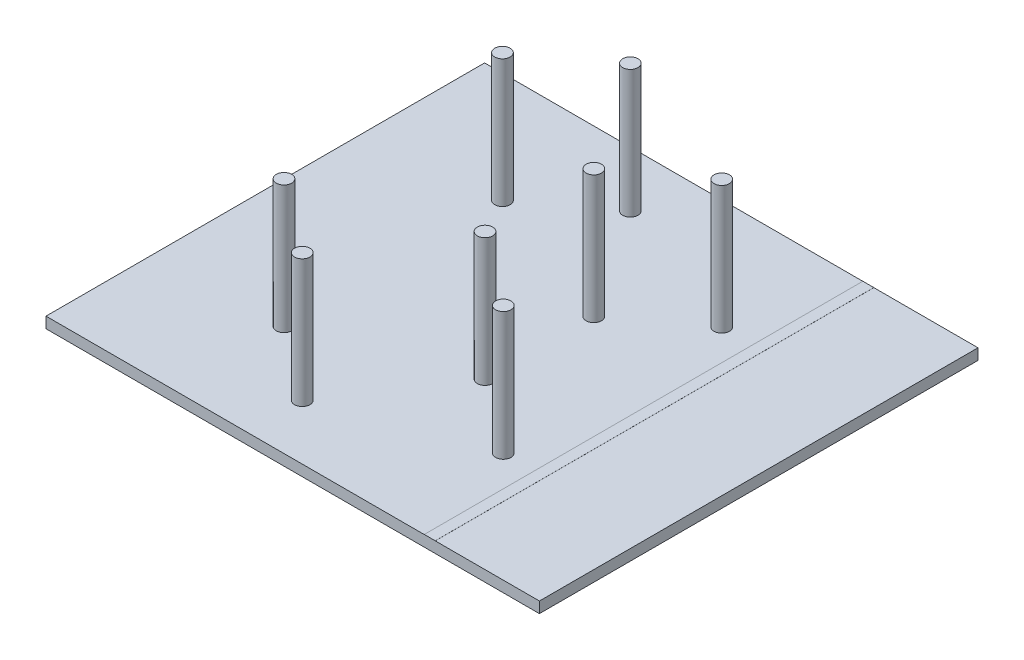
ISO-10303-21;
HEADER;
FILE_DESCRIPTION(('STEP AP214'),'2;1');
FILE_NAME('part.step','',(''),(''),'','','');
FILE_SCHEMA(('AUTOMOTIVE_DESIGN { 1 0 10303 214 1 1 1 1 }'));
ENDSEC;
DATA;
#1=APPLICATION_CONTEXT('core data for automotive mechanical design processes');
#2=APPLICATION_PROTOCOL_DEFINITION('international standard','automotive_design',2000,#1);
#3=PRODUCT_CONTEXT('',#1,'mechanical');
#4=PRODUCT('Part','Part','',(#3));
#5=PRODUCT_RELATED_PRODUCT_CATEGORY('part','',(#4));
#6=PRODUCT_DEFINITION_FORMATION('','',#4);
#7=PRODUCT_DEFINITION_CONTEXT('part definition',#1,'design');
#8=PRODUCT_DEFINITION('design','',#6,#7);
#9=PRODUCT_DEFINITION_SHAPE('','',#8);
#10=(LENGTH_UNIT() NAMED_UNIT(*) SI_UNIT(.MILLI.,.METRE.));
#11=(NAMED_UNIT(*) PLANE_ANGLE_UNIT() SI_UNIT($,.RADIAN.));
#12=(NAMED_UNIT(*) SI_UNIT($,.STERADIAN.) SOLID_ANGLE_UNIT());
#13=UNCERTAINTY_MEASURE_WITH_UNIT(LENGTH_MEASURE(1.E-05),#10,'distance_accuracy_value','');
#14=(GEOMETRIC_REPRESENTATION_CONTEXT(3) GLOBAL_UNCERTAINTY_ASSIGNED_CONTEXT((#13)) GLOBAL_UNIT_ASSIGNED_CONTEXT((#10,
#11,#12)) REPRESENTATION_CONTEXT('',''));
#15=CARTESIAN_POINT('',(0.,0.,0.));
#16=DIRECTION('',(0.,0.,1.));
#17=DIRECTION('',(1.,0.,0.));
#18=AXIS2_PLACEMENT_3D('',#15,#16,#17);
#19=CARTESIAN_POINT('',(500.,-0.0100250000000003,599.999999999999));
#20=DIRECTION('',(0.,0.,1.));
#21=DIRECTION('',(1.,0.,0.));
#22=AXIS2_PLACEMENT_3D('',#19,#20,#21);
#23=PLANE('',#22);
#24=DIRECTION('',(1.,0.,0.));
#25=VECTOR('',#24,1.);
#26=CARTESIAN_POINT('',(0.,30.,599.999999999999));
#27=LINE('',#26,#25);
#28=CARTESIAN_POINT('',(1565.,30.,599.999999999999));
#29=VERTEX_POINT('',#28);
#30=CARTESIAN_POINT('',(1850.,30.,599.999999999999));
#31=VERTEX_POINT('',#30);
#32=EDGE_CURVE('E137',#29,#31,#27,.T.);
#33=ORIENTED_EDGE('',*,*,#32,.F.);
#34=DIRECTION('',(0.,-1.,0.));
#35=VECTOR('',#34,1.);
#36=CARTESIAN_POINT('',(1565.,30.2,599.999999999999));
#37=LINE('',#36,#35);
#38=CARTESIAN_POINT('',(1565.,30.2,599.999999999999));
#39=VERTEX_POINT('',#38);
#40=EDGE_CURVE('E131',#39,#29,#37,.T.);
#41=ORIENTED_EDGE('',*,*,#40,.F.);
#42=DIRECTION('',(-1.,0.,0.));
#43=VECTOR('',#42,1.);
#44=CARTESIAN_POINT('',(0.,30.2,599.999999999999));
#45=LINE('',#44,#43);
#46=CARTESIAN_POINT('',(1535.,30.2,599.999999999999));
#47=VERTEX_POINT('',#46);
#48=EDGE_CURVE('E140',#39,#47,#45,.T.);
#49=ORIENTED_EDGE('',*,*,#48,.T.);
#50=DIRECTION('',(0.,-1.,0.));
#51=VECTOR('',#50,1.);
#52=CARTESIAN_POINT('',(1535.,30.2,599.999999999999));
#53=LINE('',#52,#51);
#54=CARTESIAN_POINT('',(1535.,30.,599.999999999999));
#55=VERTEX_POINT('',#54);
#56=EDGE_CURVE('E147',#47,#55,#53,.T.);
#57=ORIENTED_EDGE('',*,*,#56,.T.);
#58=DIRECTION('',(1.,0.,0.));
#59=VECTOR('',#58,1.);
#60=CARTESIAN_POINT('',(1.33226762955019E-13,30.,600.));
#61=LINE('',#60,#59);
#62=CARTESIAN_POINT('',(500.,30.0000000000001,600.));
#63=VERTEX_POINT('',#62);
#64=EDGE_CURVE('E154',#63,#55,#61,.T.);
#65=ORIENTED_EDGE('',*,*,#64,.F.);
#66=DIRECTION('',(0.,1.,0.));
#67=VECTOR('',#66,1.);
#68=CARTESIAN_POINT('',(500.,-0.00999999999999959,600.));
#69=LINE('',#68,#67);
#70=CARTESIAN_POINT('',(500.,0.,600.));
#71=VERTEX_POINT('',#70);
#72=EDGE_CURVE('E62',#71,#63,#69,.T.);
#73=ORIENTED_EDGE('',*,*,#72,.F.);
#74=DIRECTION('',(1.,0.,0.));
#75=VECTOR('',#74,1.);
#76=CARTESIAN_POINT('',(1.33226762955019E-13,0.,600.));
#77=LINE('',#76,#75);
#78=CARTESIAN_POINT('',(1850.,0.,599.999999999999));
#79=VERTEX_POINT('',#78);
#80=EDGE_CURVE('E112',#71,#79,#77,.T.);
#81=ORIENTED_EDGE('',*,*,#80,.T.);
#82=DIRECTION('',(0.,1.,0.));
#83=VECTOR('',#82,1.);
#84=CARTESIAN_POINT('',(1850.,-0.0100250000000003,599.999999999999));
#85=LINE('',#84,#83);
#86=EDGE_CURVE('E119',#79,#31,#85,.T.);
#87=ORIENTED_EDGE('',*,*,#86,.T.);
#88=EDGE_LOOP('',(#33,#41,#49,#57,#65,#73,#81,#87));
#89=FACE_BOUND('',#88,.T.);
#90=ADVANCED_FACE('F37',(#89),#23,.T.);
#91=CARTESIAN_POINT('',(500.,-0.0100250000000003,-600.));
#92=DIRECTION('',(0.,0.,-1.));
#93=DIRECTION('',(-1.,0.,0.));
#94=AXIS2_PLACEMENT_3D('',#91,#92,#93);
#95=PLANE('',#94);
#96=DIRECTION('',(-1.,0.,0.));
#97=VECTOR('',#96,1.);
#98=CARTESIAN_POINT('',(0.,30.,-600.));
#99=LINE('',#98,#97);
#100=CARTESIAN_POINT('',(1850.,30.,-600.));
#101=VERTEX_POINT('',#100);
#102=CARTESIAN_POINT('',(1565.,30.,-600.));
#103=VERTEX_POINT('',#102);
#104=EDGE_CURVE('E124',#101,#103,#99,.T.);
#105=ORIENTED_EDGE('',*,*,#104,.F.);
#106=DIRECTION('',(0.,1.,0.));
#107=VECTOR('',#106,1.);
#108=CARTESIAN_POINT('',(1850.,30.,-600.));
#109=LINE('',#108,#107);
#110=CARTESIAN_POINT('',(1850.,0.,-600.));
#111=VERTEX_POINT('',#110);
#112=EDGE_CURVE('E116',#111,#101,#109,.T.);
#113=ORIENTED_EDGE('',*,*,#112,.F.);
#114=DIRECTION('',(1.,0.,0.));
#115=VECTOR('',#114,1.);
#116=CARTESIAN_POINT('',(0.,0.,-600.));
#117=LINE('',#116,#115);
#118=CARTESIAN_POINT('',(500.,0.,-600.));
#119=VERTEX_POINT('',#118);
#120=EDGE_CURVE('E104',#119,#111,#117,.T.);
#121=ORIENTED_EDGE('',*,*,#120,.F.);
#122=DIRECTION('',(0.,1.,0.));
#123=VECTOR('',#122,1.);
#124=CARTESIAN_POINT('',(500.,-0.00999999999999959,-600.));
#125=LINE('',#124,#123);
#126=CARTESIAN_POINT('',(500.,30.0000000000001,-600.));
#127=VERTEX_POINT('',#126);
#128=EDGE_CURVE('E128',#119,#127,#125,.T.);
#129=ORIENTED_EDGE('',*,*,#128,.T.);
#130=DIRECTION('',(1.,0.,0.));
#131=VECTOR('',#130,1.);
#132=CARTESIAN_POINT('',(0.,30.,-600.));
#133=LINE('',#132,#131);
#134=CARTESIAN_POINT('',(1535.,30.,-600.));
#135=VERTEX_POINT('',#134);
#136=EDGE_CURVE('E120',#127,#135,#133,.T.);
#137=ORIENTED_EDGE('',*,*,#136,.T.);
#138=DIRECTION('',(0.,1.,0.));
#139=VECTOR('',#138,1.);
#140=CARTESIAN_POINT('',(1535.,30.2,-600.));
#141=LINE('',#140,#139);
#142=CARTESIAN_POINT('',(1535.,30.2,-600.));
#143=VERTEX_POINT('',#142);
#144=EDGE_CURVE('E150',#135,#143,#141,.T.);
#145=ORIENTED_EDGE('',*,*,#144,.T.);
#146=DIRECTION('',(1.,0.,0.));
#147=VECTOR('',#146,1.);
#148=CARTESIAN_POINT('',(0.,30.2,-600.));
#149=LINE('',#148,#147);
#150=CARTESIAN_POINT('',(1565.,30.2,-600.));
#151=VERTEX_POINT('',#150);
#152=EDGE_CURVE('E143',#143,#151,#149,.T.);
#153=ORIENTED_EDGE('',*,*,#152,.T.);
#154=DIRECTION('',(0.,1.,0.));
#155=VECTOR('',#154,1.);
#156=CARTESIAN_POINT('',(1565.,30.2,-600.));
#157=LINE('',#156,#155);
#158=EDGE_CURVE('E126',#103,#151,#157,.T.);
#159=ORIENTED_EDGE('',*,*,#158,.F.);
#160=EDGE_LOOP('',(#105,#113,#121,#129,#137,#145,#153,#159));
#161=FACE_BOUND('',#160,.T.);
#162=ADVANCED_FACE('F122',(#161),#95,.T.);
#163=CARTESIAN_POINT('',(0.,0.,0.));
#164=DIRECTION('',(0.,1.,0.));
#165=DIRECTION('',(0.,0.,1.));
#166=AXIS2_PLACEMENT_3D('',#163,#164,#165);
#167=PLANE('',#166);
#168=DIRECTION('',(0.,0.,1.));
#169=VECTOR('',#168,1.);
#170=CARTESIAN_POINT('',(1850.,0.,0.));
#171=LINE('',#170,#169);
#172=EDGE_CURVE('E106',#111,#79,#171,.T.);
#173=ORIENTED_EDGE('',*,*,#172,.T.);
#174=ORIENTED_EDGE('',*,*,#80,.F.);
#175=DIRECTION('',(0.,0.,-1.));
#176=VECTOR('',#175,1.);
#177=CARTESIAN_POINT('',(500.,0.,0.));
#178=LINE('',#177,#176);
#179=EDGE_CURVE('E54',#71,#119,#178,.T.);
#180=ORIENTED_EDGE('',*,*,#179,.T.);
#181=ORIENTED_EDGE('',*,*,#120,.T.);
#182=EDGE_LOOP('',(#173,#174,#180,#181));
#183=FACE_BOUND('',#182,.T.);
#184=ADVANCED_FACE('F39',(#183),#167,.F.);
#185=CARTESIAN_POINT('',(1850.,30.,0.));
#186=DIRECTION('',(1.,0.,0.));
#187=DIRECTION('',(0.,0.,-1.));
#188=AXIS2_PLACEMENT_3D('',#185,#186,#187);
#189=PLANE('',#188);
#190=ORIENTED_EDGE('',*,*,#86,.F.);
#191=ORIENTED_EDGE('',*,*,#172,.F.);
#192=ORIENTED_EDGE('',*,*,#112,.T.);
#193=DIRECTION('',(0.,0.,1.));
#194=VECTOR('',#193,1.);
#195=CARTESIAN_POINT('',(1850.,30.,0.));
#196=LINE('',#195,#194);
#197=EDGE_CURVE('E153',#101,#31,#196,.T.);
#198=ORIENTED_EDGE('',*,*,#197,.T.);
#199=EDGE_LOOP('',(#190,#191,#192,#198));
#200=FACE_BOUND('',#199,.T.);
#201=ADVANCED_FACE('F115',(#200),#189,.T.);
#202=CARTESIAN_POINT('',(500.,-0.00999999999999959,600.));
#203=DIRECTION('',(1.,0.,0.));
#204=DIRECTION('',(0.,0.,-1.));
#205=AXIS2_PLACEMENT_3D('',#202,#203,#204);
#206=PLANE('',#205);
#207=DIRECTION('',(0.,0.,1.));
#208=VECTOR('',#207,1.);
#209=CARTESIAN_POINT('',(500.,30.,285.));
#210=LINE('',#209,#208);
#211=EDGE_CURVE('E111',#127,#63,#210,.T.);
#212=ORIENTED_EDGE('',*,*,#211,.F.);
#213=ORIENTED_EDGE('',*,*,#128,.F.);
#214=ORIENTED_EDGE('',*,*,#179,.F.);
#215=ORIENTED_EDGE('',*,*,#72,.T.);
#216=EDGE_LOOP('',(#212,#213,#214,#215));
#217=FACE_BOUND('',#216,.T.);
#218=ADVANCED_FACE('F230',(#217),#206,.F.);
#219=CARTESIAN_POINT('',(0.,30.,0.));
#220=DIRECTION('',(0.,1.,0.));
#221=DIRECTION('',(0.,0.,1.));
#222=AXIS2_PLACEMENT_3D('',#219,#220,#221);
#223=PLANE('',#222);
#224=DIRECTION('',(0.,0.,1.));
#225=VECTOR('',#224,1.);
#226=CARTESIAN_POINT('',(1565.,30.,-1700.));
#227=LINE('',#226,#225);
#228=EDGE_CURVE('E162',#103,#29,#227,.T.);
#229=ORIENTED_EDGE('',*,*,#228,.T.);
#230=ORIENTED_EDGE('',*,*,#32,.T.);
#231=ORIENTED_EDGE('',*,*,#197,.F.);
#232=ORIENTED_EDGE('',*,*,#104,.T.);
#233=EDGE_LOOP('',(#229,#230,#231,#232));
#234=FACE_BOUND('',#233,.T.);
#235=ADVANCED_FACE('F238',(#234),#223,.T.);
#236=CARTESIAN_POINT('',(1565.,30.2,-1700.));
#237=DIRECTION('',(1.,0.,0.));
#238=DIRECTION('',(0.,0.,-1.));
#239=AXIS2_PLACEMENT_3D('',#236,#237,#238);
#240=PLANE('',#239);
#241=DIRECTION('',(0.,0.,1.));
#242=VECTOR('',#241,1.);
#243=CARTESIAN_POINT('',(1565.,30.2,-1700.));
#244=LINE('',#243,#242);
#245=EDGE_CURVE('E158',#151,#39,#244,.T.);
#246=ORIENTED_EDGE('',*,*,#245,.T.);
#247=ORIENTED_EDGE('',*,*,#40,.T.);
#248=ORIENTED_EDGE('',*,*,#228,.F.);
#249=ORIENTED_EDGE('',*,*,#158,.T.);
#250=EDGE_LOOP('',(#246,#247,#248,#249));
#251=FACE_BOUND('',#250,.T.);
#252=ADVANCED_FACE('F241',(#251),#240,.T.);
#253=CARTESIAN_POINT('',(0.,30.2,0.));
#254=DIRECTION('',(0.,-1.,0.));
#255=DIRECTION('',(-1.,0.,0.));
#256=AXIS2_PLACEMENT_3D('',#253,#254,#255);
#257=PLANE('',#256);
#258=ORIENTED_EDGE('',*,*,#48,.F.);
#259=ORIENTED_EDGE('',*,*,#245,.F.);
#260=ORIENTED_EDGE('',*,*,#152,.F.);
#261=DIRECTION('',(0.,0.,1.));
#262=VECTOR('',#261,1.);
#263=CARTESIAN_POINT('',(1535.,30.2,-1700.));
#264=LINE('',#263,#262);
#265=EDGE_CURVE('E160',#143,#47,#264,.T.);
#266=ORIENTED_EDGE('',*,*,#265,.T.);
#267=EDGE_LOOP('',(#258,#259,#260,#266));
#268=FACE_BOUND('',#267,.T.);
#269=ADVANCED_FACE('F246',(#268),#257,.F.);
#270=CARTESIAN_POINT('',(1535.,30.2,-1700.));
#271=DIRECTION('',(1.,0.,0.));
#272=DIRECTION('',(0.,0.,-1.));
#273=AXIS2_PLACEMENT_3D('',#270,#271,#272);
#274=PLANE('',#273);
#275=ORIENTED_EDGE('',*,*,#56,.F.);
#276=ORIENTED_EDGE('',*,*,#265,.F.);
#277=ORIENTED_EDGE('',*,*,#144,.F.);
#278=DIRECTION('',(0.,0.,1.));
#279=VECTOR('',#278,1.);
#280=CARTESIAN_POINT('',(1535.,30.,-1700.));
#281=LINE('',#280,#279);
#282=EDGE_CURVE('E165',#135,#55,#281,.T.);
#283=ORIENTED_EDGE('',*,*,#282,.T.);
#284=EDGE_LOOP('',(#275,#276,#277,#283));
#285=FACE_BOUND('',#284,.T.);
#286=ADVANCED_FACE('F248',(#285),#274,.F.);
#287=CARTESIAN_POINT('',(1250.,30.,-148.836957303121));
#288=DIRECTION('',(0.,1.,0.));
#289=DIRECTION('',(0.,0.,1.));
#290=AXIS2_PLACEMENT_3D('',#287,#288,#289);
#291=CIRCLE('',#290,21.);
#292=CARTESIAN_POINT('',(1250.,30.,-127.836957303121));
#293=VERTEX_POINT('',#292);
#294=EDGE_CURVE('E267',#293,#293,#291,.T.);
#295=ORIENTED_EDGE('',*,*,#294,.F.);
#296=EDGE_LOOP('',(#295));
#297=FACE_BOUND('',#296,.T.);
#298=CARTESIAN_POINT('',(1450.,30.,-298.836957303121));
#299=DIRECTION('',(0.,1.,0.));
#300=DIRECTION('',(0.,0.,1.));
#301=AXIS2_PLACEMENT_3D('',#298,#299,#300);
#302=CIRCLE('',#301,21.);
#303=CARTESIAN_POINT('',(1450.,30.,-277.836957303121));
#304=VERTEX_POINT('',#303);
#305=EDGE_CURVE('E277',#304,#304,#302,.T.);
#306=ORIENTED_EDGE('',*,*,#305,.F.);
#307=EDGE_LOOP('',(#306));
#308=FACE_BOUND('',#307,.T.);
#309=CARTESIAN_POINT('',(1050.,30.,-448.836957303121));
#310=DIRECTION('',(0.,1.,0.));
#311=DIRECTION('',(0.,0.,1.));
#312=AXIS2_PLACEMENT_3D('',#309,#310,#311);
#313=CIRCLE('',#312,21.);
#314=CARTESIAN_POINT('',(1050.,30.,-427.836957303121));
#315=VERTEX_POINT('',#314);
#316=EDGE_CURVE('E279',#315,#315,#313,.T.);
#317=ORIENTED_EDGE('',*,*,#316,.F.);
#318=EDGE_LOOP('',(#317));
#319=FACE_BOUND('',#318,.T.);
#320=CARTESIAN_POINT('',(850.,30.,-298.836957303121));
#321=DIRECTION('',(0.,1.,0.));
#322=DIRECTION('',(0.,0.,1.));
#323=AXIS2_PLACEMENT_3D('',#320,#321,#322);
#324=CIRCLE('',#323,21.);
#325=CARTESIAN_POINT('',(850.,30.,-277.836957303121));
#326=VERTEX_POINT('',#325);
#327=EDGE_CURVE('E155',#326,#326,#324,.T.);
#328=ORIENTED_EDGE('',*,*,#327,.F.);
#329=EDGE_LOOP('',(#328));
#330=FACE_BOUND('',#329,.T.);
#331=CARTESIAN_POINT('',(1250.,30.,148.836957303121));
#332=DIRECTION('',(0.,1.,0.));
#333=DIRECTION('',(0.,0.,1.));
#334=AXIS2_PLACEMENT_3D('',#331,#332,#333);
#335=CIRCLE('',#334,21.);
#336=CARTESIAN_POINT('',(1250.,30.,169.836957303121));
#337=VERTEX_POINT('',#336);
#338=EDGE_CURVE('E192',#337,#337,#335,.T.);
#339=ORIENTED_EDGE('',*,*,#338,.F.);
#340=EDGE_LOOP('',(#339));
#341=FACE_BOUND('',#340,.T.);
#342=CARTESIAN_POINT('',(1450.,30.,298.836957303121));
#343=DIRECTION('',(0.,1.,0.));
#344=DIRECTION('',(0.,0.,1.));
#345=AXIS2_PLACEMENT_3D('',#342,#343,#344);
#346=CIRCLE('',#345,21.);
#347=CARTESIAN_POINT('',(1450.,30.,319.836957303121));
#348=VERTEX_POINT('',#347);
#349=EDGE_CURVE('E186',#348,#348,#346,.T.);
#350=ORIENTED_EDGE('',*,*,#349,.F.);
#351=EDGE_LOOP('',(#350));
#352=FACE_BOUND('',#351,.T.);
#353=CARTESIAN_POINT('',(1050.,30.,448.836957303121));
#354=DIRECTION('',(0.,1.,0.));
#355=DIRECTION('',(0.,0.,1.));
#356=AXIS2_PLACEMENT_3D('',#353,#354,#355);
#357=CIRCLE('',#356,21.);
#358=CARTESIAN_POINT('',(1050.,30.,469.836957303121));
#359=VERTEX_POINT('',#358);
#360=EDGE_CURVE('E180',#359,#359,#357,.T.);
#361=ORIENTED_EDGE('',*,*,#360,.F.);
#362=EDGE_LOOP('',(#361));
#363=FACE_BOUND('',#362,.T.);
#364=CARTESIAN_POINT('',(850.,30.,298.836957303121));
#365=DIRECTION('',(0.,1.,0.));
#366=DIRECTION('',(0.,0.,1.));
#367=AXIS2_PLACEMENT_3D('',#364,#365,#366);
#368=CIRCLE('',#367,21.);
#369=CARTESIAN_POINT('',(850.,30.,319.836957303121));
#370=VERTEX_POINT('',#369);
#371=EDGE_CURVE('E174',#370,#370,#368,.T.);
#372=ORIENTED_EDGE('',*,*,#371,.F.);
#373=EDGE_LOOP('',(#372));
#374=FACE_BOUND('',#373,.T.);
#375=ORIENTED_EDGE('',*,*,#64,.T.);
#376=ORIENTED_EDGE('',*,*,#282,.F.);
#377=ORIENTED_EDGE('',*,*,#136,.F.);
#378=ORIENTED_EDGE('',*,*,#211,.T.);
#379=EDGE_LOOP('',(#375,#376,#377,#378));
#380=FACE_BOUND('',#379,.T.);
#381=ADVANCED_FACE('F243',(#297,#308,#319,#330,#341,#352,#363,#374,#380),#223,.T.);
#382=CARTESIAN_POINT('',(850.,380.,298.836957303121));
#383=DIRECTION('',(0.,1.,0.));
#384=DIRECTION('',(0.,0.,1.));
#385=AXIS2_PLACEMENT_3D('',#382,#383,#384);
#386=PLANE('',#385);
#387=CARTESIAN_POINT('',(850.,380.,298.836957303121));
#388=DIRECTION('',(0.,1.,0.));
#389=DIRECTION('',(0.,0.,1.));
#390=AXIS2_PLACEMENT_3D('',#387,#388,#389);
#391=CIRCLE('',#390,21.);
#392=CARTESIAN_POINT('',(850.,380.,319.836957303121));
#393=VERTEX_POINT('',#392);
#394=EDGE_CURVE('E167',#393,#393,#391,.T.);
#395=ORIENTED_EDGE('',*,*,#394,.T.);
#396=EDGE_LOOP('',(#395));
#397=FACE_BOUND('',#396,.T.);
#398=ADVANCED_FACE('F236',(#397),#386,.T.);
#399=CARTESIAN_POINT('',(1050.,380.,448.836957303121));
#400=DIRECTION('',(0.,1.,0.));
#401=DIRECTION('',(0.,0.,1.));
#402=AXIS2_PLACEMENT_3D('',#399,#400,#401);
#403=PLANE('',#402);
#404=CARTESIAN_POINT('',(1050.,380.,448.836957303121));
#405=DIRECTION('',(0.,1.,0.));
#406=DIRECTION('',(0.,0.,1.));
#407=AXIS2_PLACEMENT_3D('',#404,#405,#406);
#408=CIRCLE('',#407,21.);
#409=CARTESIAN_POINT('',(1050.,380.,469.836957303121));
#410=VERTEX_POINT('',#409);
#411=EDGE_CURVE('E177',#410,#410,#408,.T.);
#412=ORIENTED_EDGE('',*,*,#411,.T.);
#413=EDGE_LOOP('',(#412));
#414=FACE_BOUND('',#413,.T.);
#415=ADVANCED_FACE('F314',(#414),#403,.T.);
#416=CARTESIAN_POINT('',(1450.,380.,298.836957303121));
#417=DIRECTION('',(0.,1.,0.));
#418=DIRECTION('',(0.,0.,1.));
#419=AXIS2_PLACEMENT_3D('',#416,#417,#418);
#420=PLANE('',#419);
#421=CARTESIAN_POINT('',(1450.,380.,298.836957303121));
#422=DIRECTION('',(0.,1.,0.));
#423=DIRECTION('',(0.,0.,1.));
#424=AXIS2_PLACEMENT_3D('',#421,#422,#423);
#425=CIRCLE('',#424,21.);
#426=CARTESIAN_POINT('',(1450.,380.,319.836957303121));
#427=VERTEX_POINT('',#426);
#428=EDGE_CURVE('E183',#427,#427,#425,.T.);
#429=ORIENTED_EDGE('',*,*,#428,.T.);
#430=EDGE_LOOP('',(#429));
#431=FACE_BOUND('',#430,.T.);
#432=ADVANCED_FACE('F319',(#431),#420,.T.);
#433=CARTESIAN_POINT('',(1250.,380.,148.836957303121));
#434=DIRECTION('',(0.,1.,0.));
#435=DIRECTION('',(0.,0.,1.));
#436=AXIS2_PLACEMENT_3D('',#433,#434,#435);
#437=PLANE('',#436);
#438=CARTESIAN_POINT('',(1250.,380.,148.836957303121));
#439=DIRECTION('',(0.,1.,0.));
#440=DIRECTION('',(0.,0.,1.));
#441=AXIS2_PLACEMENT_3D('',#438,#439,#440);
#442=CIRCLE('',#441,21.);
#443=CARTESIAN_POINT('',(1250.,380.,169.836957303121));
#444=VERTEX_POINT('',#443);
#445=EDGE_CURVE('E189',#444,#444,#442,.T.);
#446=ORIENTED_EDGE('',*,*,#445,.T.);
#447=EDGE_LOOP('',(#446));
#448=FACE_BOUND('',#447,.T.);
#449=ADVANCED_FACE('F327',(#448),#437,.T.);
#450=CARTESIAN_POINT('',(850.,380.,-298.836957303121));
#451=DIRECTION('',(0.,1.,0.));
#452=DIRECTION('',(0.,0.,-1.));
#453=AXIS2_PLACEMENT_3D('',#450,#451,#452);
#454=PLANE('',#453);
#455=CARTESIAN_POINT('',(850.,380.,-298.836957303121));
#456=DIRECTION('',(0.,-1.,0.));
#457=DIRECTION('',(0.,0.,-1.));
#458=AXIS2_PLACEMENT_3D('',#455,#456,#457);
#459=CIRCLE('',#458,21.);
#460=CARTESIAN_POINT('',(850.,380.,-319.836957303121));
#461=VERTEX_POINT('',#460);
#462=EDGE_CURVE('E195',#461,#461,#459,.T.);
#463=ORIENTED_EDGE('',*,*,#462,.F.);
#464=EDGE_LOOP('',(#463));
#465=FACE_BOUND('',#464,.T.);
#466=ADVANCED_FACE('F220',(#465),#454,.T.);
#467=CARTESIAN_POINT('',(1050.,380.,-448.836957303121));
#468=DIRECTION('',(0.,1.,0.));
#469=DIRECTION('',(0.,0.,-1.));
#470=AXIS2_PLACEMENT_3D('',#467,#468,#469);
#471=PLANE('',#470);
#472=CARTESIAN_POINT('',(1050.,380.,-448.836957303121));
#473=DIRECTION('',(0.,-1.,0.));
#474=DIRECTION('',(0.,0.,-1.));
#475=AXIS2_PLACEMENT_3D('',#472,#473,#474);
#476=CIRCLE('',#475,21.);
#477=CARTESIAN_POINT('',(1050.,380.,-469.836957303121));
#478=VERTEX_POINT('',#477);
#479=EDGE_CURVE('E200',#478,#478,#476,.T.);
#480=ORIENTED_EDGE('',*,*,#479,.F.);
#481=EDGE_LOOP('',(#480));
#482=FACE_BOUND('',#481,.T.);
#483=ADVANCED_FACE('F211',(#482),#471,.T.);
#484=CARTESIAN_POINT('',(1450.,380.,-298.836957303121));
#485=DIRECTION('',(0.,1.,0.));
#486=DIRECTION('',(0.,0.,-1.));
#487=AXIS2_PLACEMENT_3D('',#484,#485,#486);
#488=PLANE('',#487);
#489=CARTESIAN_POINT('',(1450.,380.,-298.836957303121));
#490=DIRECTION('',(0.,-1.,0.));
#491=DIRECTION('',(0.,0.,-1.));
#492=AXIS2_PLACEMENT_3D('',#489,#490,#491);
#493=CIRCLE('',#492,21.);
#494=CARTESIAN_POINT('',(1450.,380.,-319.836957303121));
#495=VERTEX_POINT('',#494);
#496=EDGE_CURVE('E46',#495,#495,#493,.T.);
#497=ORIENTED_EDGE('',*,*,#496,.F.);
#498=EDGE_LOOP('',(#497));
#499=FACE_BOUND('',#498,.T.);
#500=ADVANCED_FACE('F208',(#499),#488,.T.);
#501=CARTESIAN_POINT('',(1250.,380.,-148.836957303121));
#502=DIRECTION('',(0.,1.,0.));
#503=DIRECTION('',(0.,0.,-1.));
#504=AXIS2_PLACEMENT_3D('',#501,#502,#503);
#505=PLANE('',#504);
#506=CARTESIAN_POINT('',(1250.,380.,-148.836957303121));
#507=DIRECTION('',(0.,-1.,0.));
#508=DIRECTION('',(0.,0.,-1.));
#509=AXIS2_PLACEMENT_3D('',#506,#507,#508);
#510=CIRCLE('',#509,21.);
#511=CARTESIAN_POINT('',(1250.,380.,-169.836957303121));
#512=VERTEX_POINT('',#511);
#513=EDGE_CURVE('E11',#512,#512,#510,.T.);
#514=ORIENTED_EDGE('',*,*,#513,.F.);
#515=EDGE_LOOP('',(#514));
#516=FACE_BOUND('',#515,.T.);
#517=ADVANCED_FACE('F210',(#516),#505,.T.);
#518=CARTESIAN_POINT('',(850.,380.,298.836957303121));
#519=DIRECTION('',(0.,-1.,0.));
#520=DIRECTION('',(0.,0.,-1.));
#521=AXIS2_PLACEMENT_3D('',#518,#519,#520);
#522=CYLINDRICAL_SURFACE('',#521,21.);
#523=ORIENTED_EDGE('',*,*,#394,.F.);
#524=EDGE_LOOP('',(#523));
#525=FACE_BOUND('',#524,.T.);
#526=ORIENTED_EDGE('',*,*,#371,.T.);
#527=EDGE_LOOP('',(#526));
#528=FACE_BOUND('',#527,.T.);
#529=ADVANCED_FACE('F217',(#525,#528),#522,.T.);
#530=CARTESIAN_POINT('',(1050.,380.,448.836957303121));
#531=DIRECTION('',(0.,-1.,0.));
#532=DIRECTION('',(0.,0.,-1.));
#533=AXIS2_PLACEMENT_3D('',#530,#531,#532);
#534=CYLINDRICAL_SURFACE('',#533,21.);
#535=ORIENTED_EDGE('',*,*,#411,.F.);
#536=EDGE_LOOP('',(#535));
#537=FACE_BOUND('',#536,.T.);
#538=ORIENTED_EDGE('',*,*,#360,.T.);
#539=EDGE_LOOP('',(#538));
#540=FACE_BOUND('',#539,.T.);
#541=ADVANCED_FACE('F301',(#537,#540),#534,.T.);
#542=CARTESIAN_POINT('',(1450.,380.,298.836957303121));
#543=DIRECTION('',(0.,-1.,0.));
#544=DIRECTION('',(0.,0.,-1.));
#545=AXIS2_PLACEMENT_3D('',#542,#543,#544);
#546=CYLINDRICAL_SURFACE('',#545,21.);
#547=ORIENTED_EDGE('',*,*,#428,.F.);
#548=EDGE_LOOP('',(#547));
#549=FACE_BOUND('',#548,.T.);
#550=ORIENTED_EDGE('',*,*,#349,.T.);
#551=EDGE_LOOP('',(#550));
#552=FACE_BOUND('',#551,.T.);
#553=ADVANCED_FACE('F307',(#549,#552),#546,.T.);
#554=CARTESIAN_POINT('',(1250.,380.,148.836957303121));
#555=DIRECTION('',(0.,-1.,0.));
#556=DIRECTION('',(0.,0.,-1.));
#557=AXIS2_PLACEMENT_3D('',#554,#555,#556);
#558=CYLINDRICAL_SURFACE('',#557,21.);
#559=ORIENTED_EDGE('',*,*,#445,.F.);
#560=EDGE_LOOP('',(#559));
#561=FACE_BOUND('',#560,.T.);
#562=ORIENTED_EDGE('',*,*,#338,.T.);
#563=EDGE_LOOP('',(#562));
#564=FACE_BOUND('',#563,.T.);
#565=ADVANCED_FACE('F323',(#561,#564),#558,.T.);
#566=CARTESIAN_POINT('',(850.,380.,-298.836957303121));
#567=DIRECTION('',(0.,-1.,0.));
#568=DIRECTION('',(0.,0.,-1.));
#569=AXIS2_PLACEMENT_3D('',#566,#567,#568);
#570=CYLINDRICAL_SURFACE('',#569,21.);
#571=ORIENTED_EDGE('',*,*,#462,.T.);
#572=EDGE_LOOP('',(#571));
#573=FACE_BOUND('',#572,.T.);
#574=ORIENTED_EDGE('',*,*,#327,.T.);
#575=EDGE_LOOP('',(#574));
#576=FACE_BOUND('',#575,.T.);
#577=ADVANCED_FACE('F286',(#573,#576),#570,.T.);
#578=CARTESIAN_POINT('',(1050.,380.,-448.836957303121));
#579=DIRECTION('',(0.,-1.,0.));
#580=DIRECTION('',(0.,0.,-1.));
#581=AXIS2_PLACEMENT_3D('',#578,#579,#580);
#582=CYLINDRICAL_SURFACE('',#581,21.);
#583=ORIENTED_EDGE('',*,*,#479,.T.);
#584=EDGE_LOOP('',(#583));
#585=FACE_BOUND('',#584,.T.);
#586=ORIENTED_EDGE('',*,*,#316,.T.);
#587=EDGE_LOOP('',(#586));
#588=FACE_BOUND('',#587,.T.);
#589=ADVANCED_FACE('F337',(#585,#588),#582,.T.);
#590=CARTESIAN_POINT('',(1450.,380.,-298.836957303121));
#591=DIRECTION('',(0.,-1.,0.));
#592=DIRECTION('',(0.,0.,-1.));
#593=AXIS2_PLACEMENT_3D('',#590,#591,#592);
#594=CYLINDRICAL_SURFACE('',#593,21.);
#595=ORIENTED_EDGE('',*,*,#496,.T.);
#596=EDGE_LOOP('',(#595));
#597=FACE_BOUND('',#596,.T.);
#598=ORIENTED_EDGE('',*,*,#305,.T.);
#599=EDGE_LOOP('',(#598));
#600=FACE_BOUND('',#599,.T.);
#601=ADVANCED_FACE('F205',(#597,#600),#594,.T.);
#602=CARTESIAN_POINT('',(1250.,380.,-148.836957303121));
#603=DIRECTION('',(0.,-1.,0.));
#604=DIRECTION('',(0.,0.,-1.));
#605=AXIS2_PLACEMENT_3D('',#602,#603,#604);
#606=CYLINDRICAL_SURFACE('',#605,21.);
#607=ORIENTED_EDGE('',*,*,#513,.T.);
#608=EDGE_LOOP('',(#607));
#609=FACE_BOUND('',#608,.T.);
#610=ORIENTED_EDGE('',*,*,#294,.T.);
#611=EDGE_LOOP('',(#610));
#612=FACE_BOUND('',#611,.T.);
#613=ADVANCED_FACE('F291',(#609,#612),#606,.T.);
#614=CLOSED_SHELL('',(#90,#162,#184,#201,#218,#235,#252,#269,#286,#381,#398,#415,#432,#449,#466,
#483,#500,#517,#529,#541,#553,#565,#577,#589,#601,#613));
#615=MANIFOLD_SOLID_BREP('B2',#614);
#616=ADVANCED_BREP_SHAPE_REPRESENTATION('',(#18,#615),#14);
#617=SHAPE_DEFINITION_REPRESENTATION(#9,#616);
ENDSEC;
END-ISO-10303-21;
